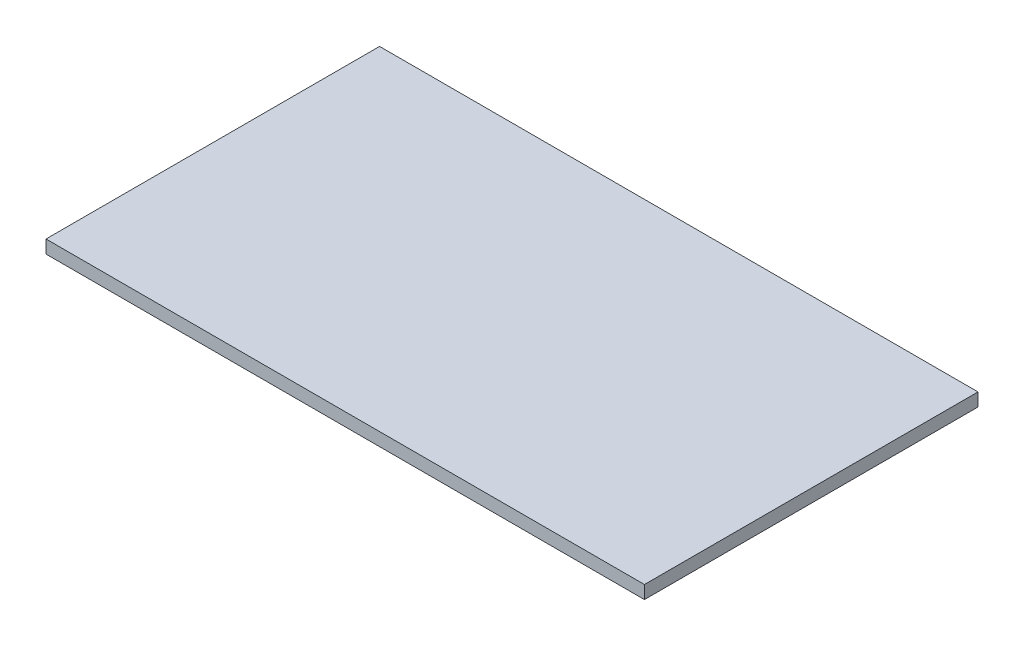
ISO-10303-21;
HEADER;
FILE_DESCRIPTION(('STEP AP214'),'2;1');
FILE_NAME('part.step','',(''),(''),'','','');
FILE_SCHEMA(('AUTOMOTIVE_DESIGN { 1 0 10303 214 1 1 1 1 }'));
ENDSEC;
DATA;
#1=APPLICATION_CONTEXT('core data for automotive mechanical design processes');
#2=APPLICATION_PROTOCOL_DEFINITION('international standard','automotive_design',2000,#1);
#3=PRODUCT_CONTEXT('',#1,'mechanical');
#4=PRODUCT('Part','Part','',(#3));
#5=PRODUCT_RELATED_PRODUCT_CATEGORY('part','',(#4));
#6=PRODUCT_DEFINITION_FORMATION('','',#4);
#7=PRODUCT_DEFINITION_CONTEXT('part definition',#1,'design');
#8=PRODUCT_DEFINITION('design','',#6,#7);
#9=PRODUCT_DEFINITION_SHAPE('','',#8);
#10=(LENGTH_UNIT() NAMED_UNIT(*) SI_UNIT(.MILLI.,.METRE.));
#11=(NAMED_UNIT(*) PLANE_ANGLE_UNIT() SI_UNIT($,.RADIAN.));
#12=(NAMED_UNIT(*) SI_UNIT($,.STERADIAN.) SOLID_ANGLE_UNIT());
#13=UNCERTAINTY_MEASURE_WITH_UNIT(LENGTH_MEASURE(1.E-05),#10,'distance_accuracy_value','');
#14=(GEOMETRIC_REPRESENTATION_CONTEXT(3) GLOBAL_UNCERTAINTY_ASSIGNED_CONTEXT((#13)) GLOBAL_UNIT_ASSIGNED_CONTEXT((#10,
#11,#12)) REPRESENTATION_CONTEXT('',''));
#15=CARTESIAN_POINT('',(0.,0.,0.));
#16=DIRECTION('',(0.,0.,1.));
#17=DIRECTION('',(1.,0.,0.));
#18=AXIS2_PLACEMENT_3D('',#15,#16,#17);
#19=CARTESIAN_POINT('',(0.,4.,0.));
#20=DIRECTION('',(1.,0.,0.));
#21=DIRECTION('',(0.,0.,-1.));
#22=AXIS2_PLACEMENT_3D('',#19,#20,#21);
#23=PLANE('',#22);
#24=DIRECTION('',(0.,0.,1.));
#25=VECTOR('',#24,1.);
#26=CARTESIAN_POINT('',(0.,0.,0.));
#27=LINE('',#26,#25);
#28=CARTESIAN_POINT('',(0.,0.,-102.));
#29=VERTEX_POINT('',#28);
#30=CARTESIAN_POINT('',(0.,0.,0.));
#31=VERTEX_POINT('',#30);
#32=EDGE_CURVE('E98',#29,#31,#27,.T.);
#33=ORIENTED_EDGE('',*,*,#32,.T.);
#34=DIRECTION('',(0.,-1.,0.));
#35=VECTOR('',#34,1.);
#36=CARTESIAN_POINT('',(0.,4.,0.));
#37=LINE('',#36,#35);
#38=CARTESIAN_POINT('',(0.,4.,0.));
#39=VERTEX_POINT('',#38);
#40=EDGE_CURVE('E11',#39,#31,#37,.T.);
#41=ORIENTED_EDGE('',*,*,#40,.F.);
#42=DIRECTION('',(0.,0.,1.));
#43=VECTOR('',#42,1.);
#44=CARTESIAN_POINT('',(0.,4.,0.));
#45=LINE('',#44,#43);
#46=CARTESIAN_POINT('',(0.,4.,-102.));
#47=VERTEX_POINT('',#46);
#48=EDGE_CURVE('E86',#47,#39,#45,.T.);
#49=ORIENTED_EDGE('',*,*,#48,.F.);
#50=DIRECTION('',(0.,-1.,0.));
#51=VECTOR('',#50,1.);
#52=CARTESIAN_POINT('',(0.,4.,-102.));
#53=LINE('',#52,#51);
#54=EDGE_CURVE('E94',#47,#29,#53,.T.);
#55=ORIENTED_EDGE('',*,*,#54,.T.);
#56=EDGE_LOOP('',(#33,#41,#49,#55));
#57=FACE_BOUND('',#56,.T.);
#58=ADVANCED_FACE('F35',(#57),#23,.F.);
#59=CARTESIAN_POINT('',(0.,4.,0.));
#60=DIRECTION('',(0.,0.,-1.));
#61=DIRECTION('',(-1.,0.,0.));
#62=AXIS2_PLACEMENT_3D('',#59,#60,#61);
#63=PLANE('',#62);
#64=DIRECTION('',(1.,0.,0.));
#65=VECTOR('',#64,1.);
#66=CARTESIAN_POINT('',(0.,0.,0.));
#67=LINE('',#66,#65);
#68=CARTESIAN_POINT('',(183.,0.,0.));
#69=VERTEX_POINT('',#68);
#70=EDGE_CURVE('E90',#31,#69,#67,.T.);
#71=ORIENTED_EDGE('',*,*,#70,.T.);
#72=DIRECTION('',(0.,-1.,0.));
#73=VECTOR('',#72,1.);
#74=CARTESIAN_POINT('',(183.,4.,0.));
#75=LINE('',#74,#73);
#76=CARTESIAN_POINT('',(183.,4.,0.));
#77=VERTEX_POINT('',#76);
#78=EDGE_CURVE('E43',#77,#69,#75,.T.);
#79=ORIENTED_EDGE('',*,*,#78,.F.);
#80=DIRECTION('',(1.,0.,0.));
#81=VECTOR('',#80,1.);
#82=CARTESIAN_POINT('',(0.,4.,0.));
#83=LINE('',#82,#81);
#84=EDGE_CURVE('E81',#39,#77,#83,.T.);
#85=ORIENTED_EDGE('',*,*,#84,.F.);
#86=ORIENTED_EDGE('',*,*,#40,.T.);
#87=EDGE_LOOP('',(#71,#79,#85,#86));
#88=FACE_BOUND('',#87,.T.);
#89=ADVANCED_FACE('F89',(#88),#63,.F.);
#90=CARTESIAN_POINT('',(183.,4.,0.));
#91=DIRECTION('',(-1.,0.,0.));
#92=DIRECTION('',(0.,0.,1.));
#93=AXIS2_PLACEMENT_3D('',#90,#91,#92);
#94=PLANE('',#93);
#95=DIRECTION('',(0.,0.,-1.));
#96=VECTOR('',#95,1.);
#97=CARTESIAN_POINT('',(183.,0.,0.));
#98=LINE('',#97,#96);
#99=CARTESIAN_POINT('',(183.,0.,-102.));
#100=VERTEX_POINT('',#99);
#101=EDGE_CURVE('E68',#69,#100,#98,.T.);
#102=ORIENTED_EDGE('',*,*,#101,.T.);
#103=DIRECTION('',(0.,-1.,0.));
#104=VECTOR('',#103,1.);
#105=CARTESIAN_POINT('',(183.,4.,-102.));
#106=LINE('',#105,#104);
#107=CARTESIAN_POINT('',(183.,4.,-102.));
#108=VERTEX_POINT('',#107);
#109=EDGE_CURVE('E91',#108,#100,#106,.T.);
#110=ORIENTED_EDGE('',*,*,#109,.F.);
#111=DIRECTION('',(0.,0.,-1.));
#112=VECTOR('',#111,1.);
#113=CARTESIAN_POINT('',(183.,4.,0.));
#114=LINE('',#113,#112);
#115=EDGE_CURVE('E84',#77,#108,#114,.T.);
#116=ORIENTED_EDGE('',*,*,#115,.F.);
#117=ORIENTED_EDGE('',*,*,#78,.T.);
#118=EDGE_LOOP('',(#102,#110,#116,#117));
#119=FACE_BOUND('',#118,.T.);
#120=ADVANCED_FACE('F92',(#119),#94,.F.);
#121=CARTESIAN_POINT('',(0.,4.,-102.));
#122=DIRECTION('',(0.,0.,1.));
#123=DIRECTION('',(1.,0.,0.));
#124=AXIS2_PLACEMENT_3D('',#121,#122,#123);
#125=PLANE('',#124);
#126=DIRECTION('',(-1.,0.,0.));
#127=VECTOR('',#126,1.);
#128=CARTESIAN_POINT('',(0.,0.,-102.));
#129=LINE('',#128,#127);
#130=EDGE_CURVE('E74',#100,#29,#129,.T.);
#131=ORIENTED_EDGE('',*,*,#130,.T.);
#132=ORIENTED_EDGE('',*,*,#54,.F.);
#133=DIRECTION('',(-1.,0.,0.));
#134=VECTOR('',#133,1.);
#135=CARTESIAN_POINT('',(0.,4.,-102.));
#136=LINE('',#135,#134);
#137=EDGE_CURVE('E51',#108,#47,#136,.T.);
#138=ORIENTED_EDGE('',*,*,#137,.F.);
#139=ORIENTED_EDGE('',*,*,#109,.T.);
#140=EDGE_LOOP('',(#131,#132,#138,#139));
#141=FACE_BOUND('',#140,.T.);
#142=ADVANCED_FACE('F105',(#141),#125,.F.);
#143=CARTESIAN_POINT('',(0.,4.,0.));
#144=DIRECTION('',(0.,-1.,0.));
#145=DIRECTION('',(0.,0.,-1.));
#146=AXIS2_PLACEMENT_3D('',#143,#144,#145);
#147=PLANE('',#146);
#148=ORIENTED_EDGE('',*,*,#48,.T.);
#149=ORIENTED_EDGE('',*,*,#84,.T.);
#150=ORIENTED_EDGE('',*,*,#115,.T.);
#151=ORIENTED_EDGE('',*,*,#137,.T.);
#152=EDGE_LOOP('',(#148,#149,#150,#151));
#153=FACE_BOUND('',#152,.T.);
#154=ADVANCED_FACE('F82',(#153),#147,.F.);
#155=CARTESIAN_POINT('',(0.,0.,0.));
#156=DIRECTION('',(0.,-1.,0.));
#157=DIRECTION('',(0.,0.,-1.));
#158=AXIS2_PLACEMENT_3D('',#155,#156,#157);
#159=PLANE('',#158);
#160=ORIENTED_EDGE('',*,*,#32,.F.);
#161=ORIENTED_EDGE('',*,*,#130,.F.);
#162=ORIENTED_EDGE('',*,*,#101,.F.);
#163=ORIENTED_EDGE('',*,*,#70,.F.);
#164=EDGE_LOOP('',(#160,#161,#162,#163));
#165=FACE_BOUND('',#164,.T.);
#166=ADVANCED_FACE('F108',(#165),#159,.T.);
#167=CLOSED_SHELL('',(#58,#89,#120,#142,#154,#166));
#168=MANIFOLD_SOLID_BREP('B2',#167);
#169=ADVANCED_BREP_SHAPE_REPRESENTATION('',(#18,#168),#14);
#170=SHAPE_DEFINITION_REPRESENTATION(#9,#169);
ENDSEC;
END-ISO-10303-21;
